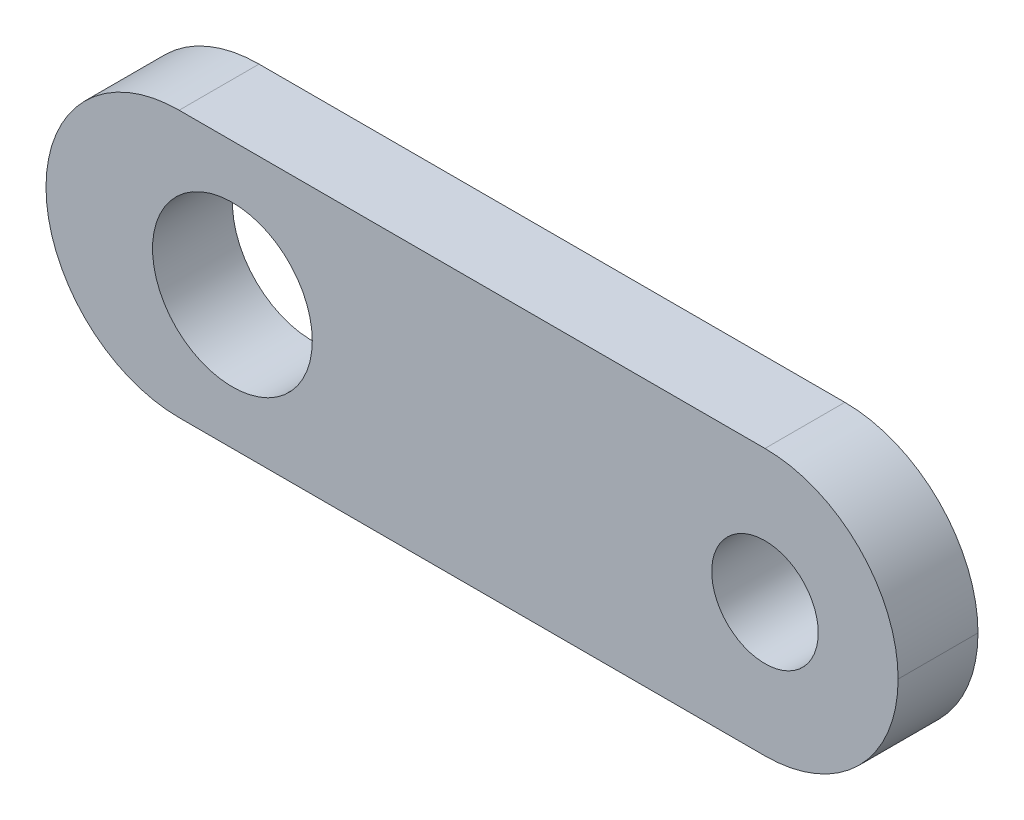
ISO-10303-21;
HEADER;
FILE_DESCRIPTION(('STEP AP214'),'2;1');
FILE_NAME('part.step','',(''),(''),'','','');
FILE_SCHEMA(('AUTOMOTIVE_DESIGN { 1 0 10303 214 1 1 1 1 }'));
ENDSEC;
DATA;
#1=APPLICATION_CONTEXT('core data for automotive mechanical design processes');
#2=APPLICATION_PROTOCOL_DEFINITION('international standard','automotive_design',2000,#1);
#3=PRODUCT_CONTEXT('',#1,'mechanical');
#4=PRODUCT('Part','Part','',(#3));
#5=PRODUCT_RELATED_PRODUCT_CATEGORY('part','',(#4));
#6=PRODUCT_DEFINITION_FORMATION('','',#4);
#7=PRODUCT_DEFINITION_CONTEXT('part definition',#1,'design');
#8=PRODUCT_DEFINITION('design','',#6,#7);
#9=PRODUCT_DEFINITION_SHAPE('','',#8);
#10=(LENGTH_UNIT() NAMED_UNIT(*) SI_UNIT(.MILLI.,.METRE.));
#11=(NAMED_UNIT(*) PLANE_ANGLE_UNIT() SI_UNIT($,.RADIAN.));
#12=(NAMED_UNIT(*) SI_UNIT($,.STERADIAN.) SOLID_ANGLE_UNIT());
#13=UNCERTAINTY_MEASURE_WITH_UNIT(LENGTH_MEASURE(1.E-05),#10,'distance_accuracy_value','');
#14=(GEOMETRIC_REPRESENTATION_CONTEXT(3) GLOBAL_UNCERTAINTY_ASSIGNED_CONTEXT((#13)) GLOBAL_UNIT_ASSIGNED_CONTEXT((#10,
#11,#12)) REPRESENTATION_CONTEXT('',''));
#15=CARTESIAN_POINT('',(0.,0.,0.));
#16=DIRECTION('',(0.,0.,1.));
#17=DIRECTION('',(1.,0.,0.));
#18=AXIS2_PLACEMENT_3D('',#15,#16,#17);
#19=CARTESIAN_POINT('',(0.,0.,3.));
#20=DIRECTION('',(0.,0.,-1.));
#21=DIRECTION('',(-1.,0.,0.));
#22=AXIS2_PLACEMENT_3D('',#19,#20,#21);
#23=PLANE('',#22);
#24=DIRECTION('',(1.,0.,0.));
#25=VECTOR('',#24,1.);
#26=CARTESIAN_POINT('',(-7.,-5.,3.));
#27=LINE('',#26,#25);
#28=CARTESIAN_POINT('',(-2.,-5.,3.));
#29=VERTEX_POINT('',#28);
#30=CARTESIAN_POINT('',(20.,-5.,3.));
#31=VERTEX_POINT('',#30);
#32=EDGE_CURVE('E138',#29,#31,#27,.T.);
#33=ORIENTED_EDGE('',*,*,#32,.T.);
#34=CARTESIAN_POINT('',(20.,0.,3.));
#35=DIRECTION('',(0.,0.,-1.));
#36=DIRECTION('',(-1.,0.,0.));
#37=AXIS2_PLACEMENT_3D('',#34,#35,#36);
#38=CIRCLE('',#37,5.);
#39=CARTESIAN_POINT('',(25.,0.,3.));
#40=VERTEX_POINT('',#39);
#41=EDGE_CURVE('E133',#31,#40,#38,.F.);
#42=ORIENTED_EDGE('',*,*,#41,.T.);
#43=CARTESIAN_POINT('',(20.,0.,3.));
#44=DIRECTION('',(0.,0.,-1.));
#45=DIRECTION('',(-1.,0.,0.));
#46=AXIS2_PLACEMENT_3D('',#43,#44,#45);
#47=CIRCLE('',#46,5.);
#48=CARTESIAN_POINT('',(20.,5.,3.));
#49=VERTEX_POINT('',#48);
#50=EDGE_CURVE('E114',#40,#49,#47,.F.);
#51=ORIENTED_EDGE('',*,*,#50,.T.);
#52=DIRECTION('',(-1.,0.,0.));
#53=VECTOR('',#52,1.);
#54=CARTESIAN_POINT('',(-7.,5.,3.));
#55=LINE('',#54,#53);
#56=CARTESIAN_POINT('',(-2.,5.,3.));
#57=VERTEX_POINT('',#56);
#58=EDGE_CURVE('E143',#49,#57,#55,.T.);
#59=ORIENTED_EDGE('',*,*,#58,.T.);
#60=CARTESIAN_POINT('',(-2.,0.,3.));
#61=DIRECTION('',(0.,0.,-1.));
#62=DIRECTION('',(-1.,0.,0.));
#63=AXIS2_PLACEMENT_3D('',#60,#61,#62);
#64=CIRCLE('',#63,5.);
#65=CARTESIAN_POINT('',(-7.,0.,3.));
#66=VERTEX_POINT('',#65);
#67=EDGE_CURVE('E59',#57,#66,#64,.F.);
#68=ORIENTED_EDGE('',*,*,#67,.T.);
#69=CARTESIAN_POINT('',(-2.,0.,3.));
#70=DIRECTION('',(0.,0.,-1.));
#71=DIRECTION('',(-1.,0.,0.));
#72=AXIS2_PLACEMENT_3D('',#69,#70,#71);
#73=CIRCLE('',#72,5.);
#74=EDGE_CURVE('E126',#66,#29,#73,.F.);
#75=ORIENTED_EDGE('',*,*,#74,.T.);
#76=EDGE_LOOP('',(#33,#42,#51,#59,#68,#75));
#77=FACE_BOUND('',#76,.T.);
#78=CARTESIAN_POINT('',(0.,0.,3.));
#79=DIRECTION('',(0.,0.,1.));
#80=DIRECTION('',(1.,0.,0.));
#81=AXIS2_PLACEMENT_3D('',#78,#79,#80);
#82=CIRCLE('',#81,3.);
#83=CARTESIAN_POINT('',(3.,0.,3.));
#84=VERTEX_POINT('',#83);
#85=EDGE_CURVE('E145',#84,#84,#82,.T.);
#86=ORIENTED_EDGE('',*,*,#85,.F.);
#87=EDGE_LOOP('',(#86));
#88=FACE_BOUND('',#87,.T.);
#89=CARTESIAN_POINT('',(20.,0.,3.));
#90=DIRECTION('',(0.,0.,1.));
#91=DIRECTION('',(1.,0.,0.));
#92=AXIS2_PLACEMENT_3D('',#89,#90,#91);
#93=CIRCLE('',#92,2.);
#94=CARTESIAN_POINT('',(22.,0.,3.));
#95=VERTEX_POINT('',#94);
#96=EDGE_CURVE('E186',#95,#95,#93,.T.);
#97=ORIENTED_EDGE('',*,*,#96,.F.);
#98=EDGE_LOOP('',(#97));
#99=FACE_BOUND('',#98,.T.);
#100=ADVANCED_FACE('F41',(#77,#88,#99),#23,.F.);
#101=CARTESIAN_POINT('',(0.,0.,0.));
#102=DIRECTION('',(0.,0.,-1.));
#103=DIRECTION('',(-1.,0.,0.));
#104=AXIS2_PLACEMENT_3D('',#101,#102,#103);
#105=PLANE('',#104);
#106=CARTESIAN_POINT('',(0.,0.,0.));
#107=DIRECTION('',(0.,0.,1.));
#108=DIRECTION('',(1.,0.,0.));
#109=AXIS2_PLACEMENT_3D('',#106,#107,#108);
#110=CIRCLE('',#109,3.);
#111=CARTESIAN_POINT('',(3.,0.,0.));
#112=VERTEX_POINT('',#111);
#113=EDGE_CURVE('E194',#112,#112,#110,.T.);
#114=ORIENTED_EDGE('',*,*,#113,.T.);
#115=EDGE_LOOP('',(#114));
#116=FACE_BOUND('',#115,.T.);
#117=CARTESIAN_POINT('',(20.,0.,0.));
#118=DIRECTION('',(0.,0.,-1.));
#119=DIRECTION('',(-1.,0.,0.));
#120=AXIS2_PLACEMENT_3D('',#117,#118,#119);
#121=CIRCLE('',#120,5.);
#122=CARTESIAN_POINT('',(20.,5.,0.));
#123=VERTEX_POINT('',#122);
#124=CARTESIAN_POINT('',(25.,0.,0.));
#125=VERTEX_POINT('',#124);
#126=EDGE_CURVE('E96',#123,#125,#121,.T.);
#127=ORIENTED_EDGE('',*,*,#126,.T.);
#128=CARTESIAN_POINT('',(20.,0.,0.));
#129=DIRECTION('',(0.,0.,-1.));
#130=DIRECTION('',(-1.,0.,0.));
#131=AXIS2_PLACEMENT_3D('',#128,#129,#130);
#132=CIRCLE('',#131,5.);
#133=CARTESIAN_POINT('',(20.,-5.,0.));
#134=VERTEX_POINT('',#133);
#135=EDGE_CURVE('E105',#125,#134,#132,.T.);
#136=ORIENTED_EDGE('',*,*,#135,.T.);
#137=DIRECTION('',(1.,0.,0.));
#138=VECTOR('',#137,1.);
#139=CARTESIAN_POINT('',(-7.,-5.,0.));
#140=LINE('',#139,#138);
#141=CARTESIAN_POINT('',(-2.,-5.,0.));
#142=VERTEX_POINT('',#141);
#143=EDGE_CURVE('E137',#142,#134,#140,.T.);
#144=ORIENTED_EDGE('',*,*,#143,.F.);
#145=CARTESIAN_POINT('',(-2.,0.,0.));
#146=DIRECTION('',(0.,0.,-1.));
#147=DIRECTION('',(-1.,0.,0.));
#148=AXIS2_PLACEMENT_3D('',#145,#146,#147);
#149=CIRCLE('',#148,5.);
#150=CARTESIAN_POINT('',(-7.,0.,0.));
#151=VERTEX_POINT('',#150);
#152=EDGE_CURVE('E110',#142,#151,#149,.T.);
#153=ORIENTED_EDGE('',*,*,#152,.T.);
#154=CARTESIAN_POINT('',(-2.,0.,0.));
#155=DIRECTION('',(0.,0.,-1.));
#156=DIRECTION('',(-1.,0.,0.));
#157=AXIS2_PLACEMENT_3D('',#154,#155,#156);
#158=CIRCLE('',#157,5.);
#159=CARTESIAN_POINT('',(-2.,5.,0.));
#160=VERTEX_POINT('',#159);
#161=EDGE_CURVE('E146',#151,#160,#158,.T.);
#162=ORIENTED_EDGE('',*,*,#161,.T.);
#163=DIRECTION('',(-1.,0.,0.));
#164=VECTOR('',#163,1.);
#165=CARTESIAN_POINT('',(-7.,5.,0.));
#166=LINE('',#165,#164);
#167=EDGE_CURVE('E102',#123,#160,#166,.T.);
#168=ORIENTED_EDGE('',*,*,#167,.F.);
#169=EDGE_LOOP('',(#127,#136,#144,#153,#162,#168));
#170=FACE_BOUND('',#169,.T.);
#171=CARTESIAN_POINT('',(20.,0.,0.));
#172=DIRECTION('',(0.,0.,1.));
#173=DIRECTION('',(1.,0.,0.));
#174=AXIS2_PLACEMENT_3D('',#171,#172,#173);
#175=CIRCLE('',#174,2.);
#176=CARTESIAN_POINT('',(22.,0.,0.));
#177=VERTEX_POINT('',#176);
#178=EDGE_CURVE('E113',#177,#177,#175,.T.);
#179=ORIENTED_EDGE('',*,*,#178,.T.);
#180=EDGE_LOOP('',(#179));
#181=FACE_BOUND('',#180,.T.);
#182=ADVANCED_FACE('F98',(#116,#170,#181),#105,.T.);
#183=CARTESIAN_POINT('',(-7.,5.,3.));
#184=DIRECTION('',(0.,-1.,0.));
#185=DIRECTION('',(0.,0.,-1.));
#186=AXIS2_PLACEMENT_3D('',#183,#184,#185);
#187=PLANE('',#186);
#188=ORIENTED_EDGE('',*,*,#58,.F.);
#189=DIRECTION('',(0.,0.,-1.));
#190=VECTOR('',#189,1.);
#191=CARTESIAN_POINT('',(20.,5.,3.));
#192=LINE('',#191,#190);
#193=EDGE_CURVE('E11',#49,#123,#192,.T.);
#194=ORIENTED_EDGE('',*,*,#193,.T.);
#195=ORIENTED_EDGE('',*,*,#167,.T.);
#196=DIRECTION('',(0.,0.,-1.));
#197=VECTOR('',#196,1.);
#198=CARTESIAN_POINT('',(-2.,5.,3.));
#199=LINE('',#198,#197);
#200=EDGE_CURVE('E49',#160,#57,#199,.F.);
#201=ORIENTED_EDGE('',*,*,#200,.T.);
#202=EDGE_LOOP('',(#188,#194,#195,#201));
#203=FACE_BOUND('',#202,.T.);
#204=ADVANCED_FACE('F167',(#203),#187,.F.);
#205=CARTESIAN_POINT('',(-7.,-5.,3.));
#206=DIRECTION('',(0.,1.,0.));
#207=DIRECTION('',(0.,0.,1.));
#208=AXIS2_PLACEMENT_3D('',#205,#206,#207);
#209=PLANE('',#208);
#210=ORIENTED_EDGE('',*,*,#143,.T.);
#211=DIRECTION('',(0.,0.,-1.));
#212=VECTOR('',#211,1.);
#213=CARTESIAN_POINT('',(20.,-5.,3.));
#214=LINE('',#213,#212);
#215=EDGE_CURVE('E120',#134,#31,#214,.F.);
#216=ORIENTED_EDGE('',*,*,#215,.T.);
#217=ORIENTED_EDGE('',*,*,#32,.F.);
#218=DIRECTION('',(0.,0.,-1.));
#219=VECTOR('',#218,1.);
#220=CARTESIAN_POINT('',(-2.,-5.,3.));
#221=LINE('',#220,#219);
#222=EDGE_CURVE('E116',#29,#142,#221,.T.);
#223=ORIENTED_EDGE('',*,*,#222,.T.);
#224=EDGE_LOOP('',(#210,#216,#217,#223));
#225=FACE_BOUND('',#224,.T.);
#226=ADVANCED_FACE('F136',(#225),#209,.F.);
#227=CARTESIAN_POINT('',(0.,0.,3.));
#228=DIRECTION('',(0.,0.,-1.));
#229=DIRECTION('',(-1.,0.,0.));
#230=AXIS2_PLACEMENT_3D('',#227,#228,#229);
#231=CYLINDRICAL_SURFACE('',#230,3.);
#232=ORIENTED_EDGE('',*,*,#85,.T.);
#233=EDGE_LOOP('',(#232));
#234=FACE_BOUND('',#233,.T.);
#235=ORIENTED_EDGE('',*,*,#113,.F.);
#236=EDGE_LOOP('',(#235));
#237=FACE_BOUND('',#236,.T.);
#238=ADVANCED_FACE('F168',(#234,#237),#231,.F.);
#239=CARTESIAN_POINT('',(20.,0.,3.));
#240=DIRECTION('',(0.,0.,-1.));
#241=DIRECTION('',(-1.,0.,0.));
#242=AXIS2_PLACEMENT_3D('',#239,#240,#241);
#243=CYLINDRICAL_SURFACE('',#242,2.);
#244=ORIENTED_EDGE('',*,*,#96,.T.);
#245=EDGE_LOOP('',(#244));
#246=FACE_BOUND('',#245,.T.);
#247=ORIENTED_EDGE('',*,*,#178,.F.);
#248=EDGE_LOOP('',(#247));
#249=FACE_BOUND('',#248,.T.);
#250=ADVANCED_FACE('F179',(#246,#249),#243,.F.);
#251=CARTESIAN_POINT('',(20.,0.,3.));
#252=DIRECTION('',(0.,0.,-1.));
#253=DIRECTION('',(-1.,0.,0.));
#254=AXIS2_PLACEMENT_3D('',#251,#252,#253);
#255=CYLINDRICAL_SURFACE('',#254,5.);
#256=ORIENTED_EDGE('',*,*,#193,.F.);
#257=ORIENTED_EDGE('',*,*,#50,.F.);
#258=DIRECTION('',(0.,0.,-1.));
#259=VECTOR('',#258,1.);
#260=CARTESIAN_POINT('',(25.,0.,3.));
#261=LINE('',#260,#259);
#262=EDGE_CURVE('E112',#125,#40,#261,.F.);
#263=ORIENTED_EDGE('',*,*,#262,.F.);
#264=ORIENTED_EDGE('',*,*,#126,.F.);
#265=EDGE_LOOP('',(#256,#257,#263,#264));
#266=FACE_BOUND('',#265,.T.);
#267=ADVANCED_FACE('F115',(#266),#255,.T.);
#268=CARTESIAN_POINT('',(20.,0.,3.));
#269=DIRECTION('',(0.,0.,-1.));
#270=DIRECTION('',(-1.,0.,0.));
#271=AXIS2_PLACEMENT_3D('',#268,#269,#270);
#272=CYLINDRICAL_SURFACE('',#271,5.);
#273=ORIENTED_EDGE('',*,*,#41,.F.);
#274=ORIENTED_EDGE('',*,*,#215,.F.);
#275=ORIENTED_EDGE('',*,*,#135,.F.);
#276=ORIENTED_EDGE('',*,*,#262,.T.);
#277=EDGE_LOOP('',(#273,#274,#275,#276));
#278=FACE_BOUND('',#277,.T.);
#279=ADVANCED_FACE('F119',(#278),#272,.T.);
#280=CARTESIAN_POINT('',(-2.,0.,3.));
#281=DIRECTION('',(0.,0.,-1.));
#282=DIRECTION('',(-1.,0.,0.));
#283=AXIS2_PLACEMENT_3D('',#280,#281,#282);
#284=CYLINDRICAL_SURFACE('',#283,5.);
#285=DIRECTION('',(0.,0.,-1.));
#286=VECTOR('',#285,1.);
#287=CARTESIAN_POINT('',(-7.,0.,3.));
#288=LINE('',#287,#286);
#289=EDGE_CURVE('E44',#66,#151,#288,.T.);
#290=ORIENTED_EDGE('',*,*,#289,.F.);
#291=ORIENTED_EDGE('',*,*,#67,.F.);
#292=ORIENTED_EDGE('',*,*,#200,.F.);
#293=ORIENTED_EDGE('',*,*,#161,.F.);
#294=EDGE_LOOP('',(#290,#291,#292,#293));
#295=FACE_BOUND('',#294,.T.);
#296=ADVANCED_FACE('F43',(#295),#284,.T.);
#297=CARTESIAN_POINT('',(-2.,0.,3.));
#298=DIRECTION('',(0.,0.,-1.));
#299=DIRECTION('',(-1.,0.,0.));
#300=AXIS2_PLACEMENT_3D('',#297,#298,#299);
#301=CYLINDRICAL_SURFACE('',#300,5.);
#302=ORIENTED_EDGE('',*,*,#74,.F.);
#303=ORIENTED_EDGE('',*,*,#289,.T.);
#304=ORIENTED_EDGE('',*,*,#152,.F.);
#305=ORIENTED_EDGE('',*,*,#222,.F.);
#306=EDGE_LOOP('',(#302,#303,#304,#305));
#307=FACE_BOUND('',#306,.T.);
#308=ADVANCED_FACE('F152',(#307),#301,.T.);
#309=CLOSED_SHELL('',(#100,#182,#204,#226,#238,#250,#267,#279,#296,#308));
#310=MANIFOLD_SOLID_BREP('B2',#309);
#311=ADVANCED_BREP_SHAPE_REPRESENTATION('',(#18,#310),#14);
#312=SHAPE_DEFINITION_REPRESENTATION(#9,#311);
ENDSEC;
END-ISO-10303-21;
